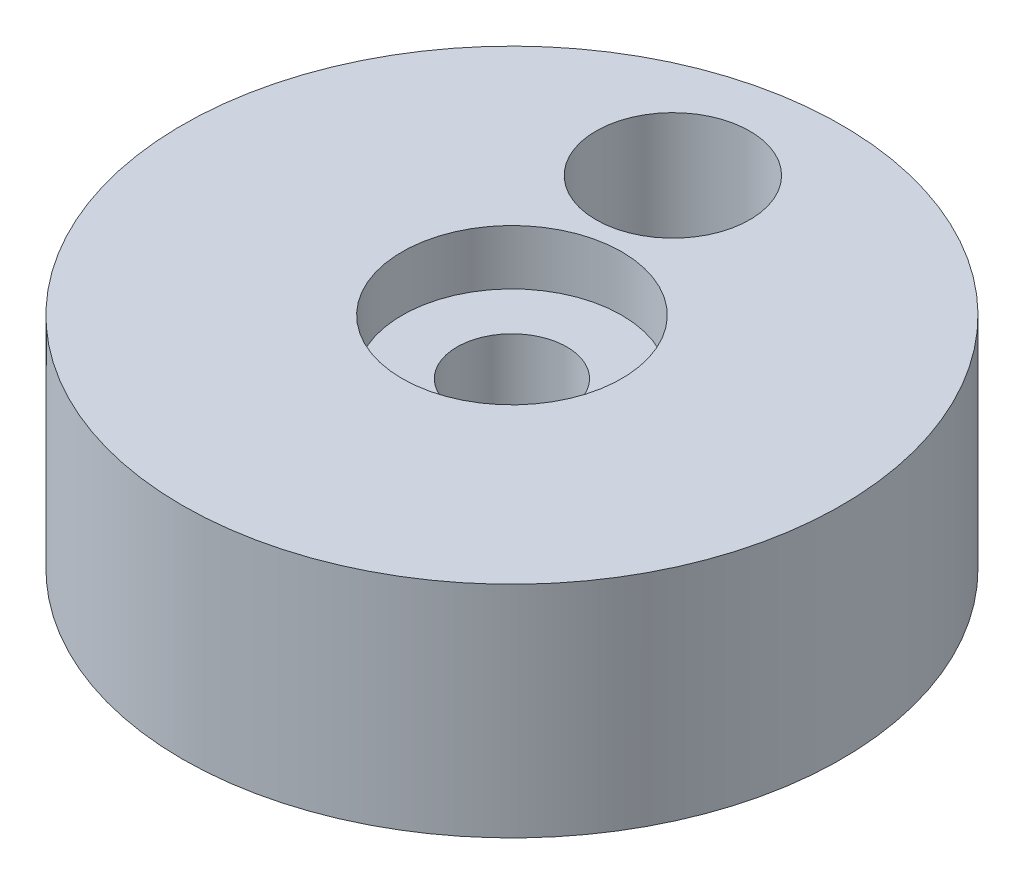
ISO-10303-21;
HEADER;
FILE_DESCRIPTION(('STEP AP214'),'2;1');
FILE_NAME('part.step','',(''),(''),'','','');
FILE_SCHEMA(('AUTOMOTIVE_DESIGN { 1 0 10303 214 1 1 1 1 }'));
ENDSEC;
DATA;
#1=APPLICATION_CONTEXT('core data for automotive mechanical design processes');
#2=APPLICATION_PROTOCOL_DEFINITION('international standard','automotive_design',2000,#1);
#3=PRODUCT_CONTEXT('',#1,'mechanical');
#4=PRODUCT('Part','Part','',(#3));
#5=PRODUCT_RELATED_PRODUCT_CATEGORY('part','',(#4));
#6=PRODUCT_DEFINITION_FORMATION('','',#4);
#7=PRODUCT_DEFINITION_CONTEXT('part definition',#1,'design');
#8=PRODUCT_DEFINITION('design','',#6,#7);
#9=PRODUCT_DEFINITION_SHAPE('','',#8);
#10=(LENGTH_UNIT() NAMED_UNIT(*) SI_UNIT(.MILLI.,.METRE.));
#11=(NAMED_UNIT(*) PLANE_ANGLE_UNIT() SI_UNIT($,.RADIAN.));
#12=(NAMED_UNIT(*) SI_UNIT($,.STERADIAN.) SOLID_ANGLE_UNIT());
#13=UNCERTAINTY_MEASURE_WITH_UNIT(LENGTH_MEASURE(1.E-05),#10,'distance_accuracy_value','');
#14=(GEOMETRIC_REPRESENTATION_CONTEXT(3) GLOBAL_UNCERTAINTY_ASSIGNED_CONTEXT((#13)) GLOBAL_UNIT_ASSIGNED_CONTEXT((#10,
#11,#12)) REPRESENTATION_CONTEXT('',''));
#15=CARTESIAN_POINT('',(0.,0.,0.));
#16=DIRECTION('',(0.,0.,1.));
#17=DIRECTION('',(1.,0.,0.));
#18=AXIS2_PLACEMENT_3D('',#15,#16,#17);
#19=CARTESIAN_POINT('',(0.,-12.7,0.));
#20=DIRECTION('',(0.,1.,0.));
#21=DIRECTION('',(0.,0.,1.));
#22=AXIS2_PLACEMENT_3D('',#19,#20,#21);
#23=CYLINDRICAL_SURFACE('',#22,19.05);
#24=CARTESIAN_POINT('',(0.,0.,0.));
#25=DIRECTION('',(0.,1.,0.));
#26=DIRECTION('',(0.,0.,1.));
#27=AXIS2_PLACEMENT_3D('',#24,#25,#26);
#28=CIRCLE('',#27,19.05);
#29=CARTESIAN_POINT('',(0.,0.,19.05));
#30=VERTEX_POINT('',#29);
#31=EDGE_CURVE('E86',#30,#30,#28,.T.);
#32=ORIENTED_EDGE('',*,*,#31,.F.);
#33=EDGE_LOOP('',(#32));
#34=FACE_BOUND('',#33,.T.);
#35=CARTESIAN_POINT('',(0.,-6.35,0.));
#36=DIRECTION('',(0.,1.,0.));
#37=DIRECTION('',(0.,0.,1.));
#38=AXIS2_PLACEMENT_3D('',#35,#36,#37);
#39=CIRCLE('',#38,19.05);
#40=CARTESIAN_POINT('',(-15.160050494038,-6.35,-11.5358297932233));
#41=VERTEX_POINT('',#40);
#42=CARTESIAN_POINT('',(-6.79711499679188,-6.35,-17.7961155233491));
#43=VERTEX_POINT('',#42);
#44=EDGE_CURVE('E11',#41,#43,#39,.F.);
#45=ORIENTED_EDGE('',*,*,#44,.F.);
#46=DIRECTION('',(0.,-1.,0.));
#47=VECTOR('',#46,1.);
#48=CARTESIAN_POINT('',(-15.160050494038,-9.525,-11.5358297932233));
#49=LINE('',#48,#47);
#50=CARTESIAN_POINT('',(-15.160050494038,-12.7,-11.5358297932233));
#51=VERTEX_POINT('',#50);
#52=EDGE_CURVE('E62',#41,#51,#49,.T.);
#53=ORIENTED_EDGE('',*,*,#52,.T.);
#54=CARTESIAN_POINT('',(0.,-12.7,0.));
#55=DIRECTION('',(0.,1.,0.));
#56=DIRECTION('',(0.,0.,1.));
#57=AXIS2_PLACEMENT_3D('',#54,#55,#56);
#58=CIRCLE('',#57,19.05);
#59=CARTESIAN_POINT('',(-6.79711499679187,-12.7,-17.7961155233491));
#60=VERTEX_POINT('',#59);
#61=EDGE_CURVE('E66',#51,#60,#58,.T.);
#62=ORIENTED_EDGE('',*,*,#61,.T.);
#63=DIRECTION('',(0.,-1.,0.));
#64=VECTOR('',#63,1.);
#65=CARTESIAN_POINT('',(-6.79711499679188,-9.525,-17.7961155233491));
#66=LINE('',#65,#64);
#67=EDGE_CURVE('E47',#60,#43,#66,.F.);
#68=ORIENTED_EDGE('',*,*,#67,.T.);
#69=EDGE_LOOP('',(#45,#53,#62,#68));
#70=FACE_BOUND('',#69,.T.);
#71=ADVANCED_FACE('F33',(#34,#70),#23,.T.);
#72=CARTESIAN_POINT('',(0.,-12.7,0.));
#73=DIRECTION('',(0.,1.,0.));
#74=DIRECTION('',(0.,0.,1.));
#75=AXIS2_PLACEMENT_3D('',#72,#73,#74);
#76=PLANE('',#75);
#77=CARTESIAN_POINT('',(0.,-12.7,0.));
#78=DIRECTION('',(0.,1.,0.));
#79=DIRECTION('',(0.,0.,1.));
#80=AXIS2_PLACEMENT_3D('',#77,#78,#79);
#81=CIRCLE('',#80,3.175);
#82=CARTESIAN_POINT('',(0.,-12.7,3.175));
#83=VERTEX_POINT('',#82);
#84=EDGE_CURVE('E83',#83,#83,#81,.T.);
#85=ORIENTED_EDGE('',*,*,#84,.T.);
#86=EDGE_LOOP('',(#85));
#87=FACE_BOUND('',#86,.T.);
#88=CARTESIAN_POINT('',(-2.34603064172123,-12.7,-11.6485670375102));
#89=DIRECTION('',(0.,1.,0.));
#90=DIRECTION('',(0.,0.,1.));
#91=AXIS2_PLACEMENT_3D('',#88,#89,#90);
#92=CIRCLE('',#91,4.445);
#93=CARTESIAN_POINT('',(-2.34603064172123,-12.7,-7.20356703751019));
#94=VERTEX_POINT('',#93);
#95=EDGE_CURVE('E73',#94,#94,#92,.T.);
#96=ORIENTED_EDGE('',*,*,#95,.T.);
#97=EDGE_LOOP('',(#96));
#98=FACE_BOUND('',#97,.T.);
#99=CARTESIAN_POINT('',(-13.4002812642719,-12.7,-17.9010499982098));
#100=DIRECTION('',(0.,1.,0.));
#101=DIRECTION('',(0.,0.,1.));
#102=AXIS2_PLACEMENT_3D('',#99,#100,#101);
#103=CIRCLE('',#102,6.604);
#104=EDGE_CURVE('E40',#60,#51,#103,.F.);
#105=ORIENTED_EDGE('',*,*,#104,.F.);
#106=ORIENTED_EDGE('',*,*,#61,.F.);
#107=EDGE_LOOP('',(#105,#106));
#108=FACE_BOUND('',#107,.T.);
#109=ADVANCED_FACE('F98',(#87,#98,#108),#76,.F.);
#110=CARTESIAN_POINT('',(0.,-17.78,0.));
#111=DIRECTION('',(0.,1.,0.));
#112=DIRECTION('',(0.,0.,1.));
#113=AXIS2_PLACEMENT_3D('',#110,#111,#112);
#114=CYLINDRICAL_SURFACE('',#113,3.175);
#115=CARTESIAN_POINT('',(0.,-3.175,0.));
#116=DIRECTION('',(0.,1.,0.));
#117=DIRECTION('',(0.,0.,1.));
#118=AXIS2_PLACEMENT_3D('',#115,#116,#117);
#119=CIRCLE('',#118,3.175);
#120=CARTESIAN_POINT('',(0.,-3.175,3.175));
#121=VERTEX_POINT('',#120);
#122=EDGE_CURVE('E80',#121,#121,#119,.F.);
#123=CARTESIAN_POINT('',(0.,-12.7,3.175));
#124=CARTESIAN_POINT('',(0.,-12.60078125,3.175));
#125=CARTESIAN_POINT('',(0.,-12.5015625,3.175));
#126=CARTESIAN_POINT('',(0.,-12.303125,3.175));
#127=CARTESIAN_POINT('',(0.,-12.20390625,3.175));
#128=CARTESIAN_POINT('',(0.,-12.00546875,3.175));
#129=CARTESIAN_POINT('',(0.,-11.90625,3.175));
#130=CARTESIAN_POINT('',(0.,-11.7078125,3.175));
#131=CARTESIAN_POINT('',(0.,-11.60859375,3.175));
#132=CARTESIAN_POINT('',(0.,-11.41015625,3.175));
#133=CARTESIAN_POINT('',(0.,-11.3109375,3.175));
#134=CARTESIAN_POINT('',(0.,-11.1125,3.175));
#135=CARTESIAN_POINT('',(0.,-11.01328125,3.175));
#136=CARTESIAN_POINT('',(0.,-10.81484375,3.175));
#137=CARTESIAN_POINT('',(0.,-10.715625,3.175));
#138=CARTESIAN_POINT('',(0.,-10.5171875,3.175));
#139=CARTESIAN_POINT('',(0.,-10.41796875,3.175));
#140=CARTESIAN_POINT('',(0.,-10.21953125,3.175));
#141=CARTESIAN_POINT('',(0.,-10.1203125,3.175));
#142=CARTESIAN_POINT('',(0.,-9.921875,3.175));
#143=CARTESIAN_POINT('',(0.,-9.82265625,3.175));
#144=CARTESIAN_POINT('',(0.,-9.62421875,3.175));
#145=CARTESIAN_POINT('',(0.,-9.525,3.175));
#146=CARTESIAN_POINT('',(0.,-9.3265625,3.175));
#147=CARTESIAN_POINT('',(0.,-9.22734375,3.175));
#148=CARTESIAN_POINT('',(0.,-9.02890625,3.175));
#149=CARTESIAN_POINT('',(0.,-8.9296875,3.175));
#150=CARTESIAN_POINT('',(0.,-8.73125,3.175));
#151=CARTESIAN_POINT('',(0.,-8.63203125,3.175));
#152=CARTESIAN_POINT('',(0.,-8.43359375,3.175));
#153=CARTESIAN_POINT('',(0.,-8.334375,3.175));
#154=CARTESIAN_POINT('',(0.,-8.1359375,3.175));
#155=CARTESIAN_POINT('',(0.,-8.03671875,3.175));
#156=CARTESIAN_POINT('',(0.,-7.83828125,3.175));
#157=CARTESIAN_POINT('',(0.,-7.7390625,3.175));
#158=CARTESIAN_POINT('',(0.,-7.540625,3.175));
#159=CARTESIAN_POINT('',(0.,-7.44140625,3.175));
#160=CARTESIAN_POINT('',(0.,-7.24296875,3.175));
#161=CARTESIAN_POINT('',(0.,-7.14375,3.175));
#162=CARTESIAN_POINT('',(0.,-6.9453125,3.175));
#163=CARTESIAN_POINT('',(0.,-6.84609375,3.175));
#164=CARTESIAN_POINT('',(0.,-6.64765625,3.175));
#165=CARTESIAN_POINT('',(0.,-6.5484375,3.175));
#166=CARTESIAN_POINT('',(0.,-6.35,3.175));
#167=CARTESIAN_POINT('',(0.,-6.25078125,3.175));
#168=CARTESIAN_POINT('',(0.,-6.05234375,3.175));
#169=CARTESIAN_POINT('',(0.,-5.953125,3.175));
#170=CARTESIAN_POINT('',(0.,-5.7546875,3.175));
#171=CARTESIAN_POINT('',(0.,-5.65546875,3.175));
#172=CARTESIAN_POINT('',(0.,-5.45703125,3.175));
#173=CARTESIAN_POINT('',(0.,-5.3578125,3.175));
#174=CARTESIAN_POINT('',(0.,-5.159375,3.175));
#175=CARTESIAN_POINT('',(0.,-5.06015625,3.175));
#176=CARTESIAN_POINT('',(0.,-4.86171875,3.175));
#177=CARTESIAN_POINT('',(0.,-4.7625,3.175));
#178=CARTESIAN_POINT('',(0.,-4.5640625,3.175));
#179=CARTESIAN_POINT('',(0.,-4.46484375,3.175));
#180=CARTESIAN_POINT('',(0.,-4.26640625,3.175));
#181=CARTESIAN_POINT('',(0.,-4.1671875,3.175));
#182=CARTESIAN_POINT('',(0.,-3.96875,3.175));
#183=CARTESIAN_POINT('',(0.,-3.86953125,3.175));
#184=CARTESIAN_POINT('',(0.,-3.67109375,3.175));
#185=CARTESIAN_POINT('',(0.,-3.571875,3.175));
#186=CARTESIAN_POINT('',(0.,-3.3734375,3.175));
#187=CARTESIAN_POINT('',(0.,-3.27421875,3.175));
#188=CARTESIAN_POINT('',(0.,-3.175,3.175));
#189=B_SPLINE_CURVE_WITH_KNOTS('',3,(#123,#124,#125,#126,#127,#128,#129,#130,#131,#132,#133,
#134,#135,#136,#137,#138,#139,#140,#141,#142,#143,#144,#145,#146,#147,#148,#149,#150,#151,#152,
#153,#154,#155,#156,#157,#158,#159,#160,#161,#162,#163,#164,#165,#166,#167,#168,#169,#170,#171,
#172,#173,#174,#175,#176,#177,#178,#179,#180,#181,#182,#183,#184,#185,#186,#187,#188),
.UNSPECIFIED.,.F.,.F.,(4,2,2,2,2,2,2,2,2,2,2,2,2,2,2,2,2,2,2,2,2,2,2,2,2,2,2,2,2,2,2,2,4),(0.,
0.29765625,0.5953125,0.892968749999999,1.190625,1.48828125,1.7859375,2.08359375,2.38125,
2.67890625,2.9765625,3.27421875,3.571875,3.86953125,4.1671875,4.46484375,4.7625,5.06015625,
5.3578125,5.65546875,5.953125,6.25078125,6.5484375,6.84609375,7.14375,7.44140625,7.7390625,
8.03671875,8.334375,8.63203125,8.9296875,9.22734375,9.525),.UNSPECIFIED.);
#190=EDGE_CURVE('BSEAM95',#83,#121,#189,.T.);
#191=ORIENTED_EDGE('',*,*,#84,.F.);
#192=ORIENTED_EDGE('',*,*,#122,.F.);
#193=ORIENTED_EDGE('',*,*,#190,.T.);
#194=ORIENTED_EDGE('',*,*,#190,.F.);
#195=EDGE_LOOP('',(#191,#193,#192,#194));
#196=FACE_BOUND('',#195,.T.);
#197=ADVANCED_FACE('F95',(#196),#114,.F.);
#198=CARTESIAN_POINT('',(0.,0.,0.));
#199=DIRECTION('',(0.,1.,0.));
#200=DIRECTION('',(0.,0.,1.));
#201=AXIS2_PLACEMENT_3D('',#198,#199,#200);
#202=PLANE('',#201);
#203=CARTESIAN_POINT('',(-2.34603064172123,0.,-11.6485670375102));
#204=DIRECTION('',(0.,1.,0.));
#205=DIRECTION('',(0.,0.,1.));
#206=AXIS2_PLACEMENT_3D('',#203,#204,#205);
#207=CIRCLE('',#206,4.445);
#208=CARTESIAN_POINT('',(-2.34603064172123,0.,-7.20356703751019));
#209=VERTEX_POINT('',#208);
#210=EDGE_CURVE('E68',#209,#209,#207,.T.);
#211=ORIENTED_EDGE('',*,*,#210,.F.);
#212=EDGE_LOOP('',(#211));
#213=FACE_BOUND('',#212,.T.);
#214=CARTESIAN_POINT('',(0.,0.,0.));
#215=DIRECTION('',(0.,1.,0.));
#216=DIRECTION('',(0.,0.,1.));
#217=AXIS2_PLACEMENT_3D('',#214,#215,#216);
#218=CIRCLE('',#217,6.35);
#219=CARTESIAN_POINT('',(0.,0.,6.35));
#220=VERTEX_POINT('',#219);
#221=EDGE_CURVE('E76',#220,#220,#218,.T.);
#222=ORIENTED_EDGE('',*,*,#221,.F.);
#223=EDGE_LOOP('',(#222));
#224=FACE_BOUND('',#223,.T.);
#225=ORIENTED_EDGE('',*,*,#31,.T.);
#226=EDGE_LOOP('',(#225));
#227=FACE_BOUND('',#226,.T.);
#228=ADVANCED_FACE('F97',(#213,#224,#227),#202,.T.);
#229=CARTESIAN_POINT('',(0.,-3.175,0.));
#230=DIRECTION('',(0.,1.,0.));
#231=DIRECTION('',(0.,0.,1.));
#232=AXIS2_PLACEMENT_3D('',#229,#230,#231);
#233=PLANE('',#232);
#234=CARTESIAN_POINT('',(0.,-3.175,0.));
#235=DIRECTION('',(0.,1.,0.));
#236=DIRECTION('',(0.,0.,1.));
#237=AXIS2_PLACEMENT_3D('',#234,#235,#236);
#238=CIRCLE('',#237,6.35);
#239=CARTESIAN_POINT('',(0.,-3.175,6.35));
#240=VERTEX_POINT('',#239);
#241=EDGE_CURVE('E77',#240,#240,#238,.T.);
#242=ORIENTED_EDGE('',*,*,#241,.T.);
#243=EDGE_LOOP('',(#242));
#244=FACE_BOUND('',#243,.T.);
#245=ORIENTED_EDGE('',*,*,#122,.T.);
#246=EDGE_LOOP('',(#245));
#247=FACE_BOUND('',#246,.T.);
#248=ADVANCED_FACE('F93',(#244,#247),#233,.T.);
#249=CARTESIAN_POINT('',(0.,-3.175,0.));
#250=DIRECTION('',(0.,1.,0.));
#251=DIRECTION('',(0.,0.,1.));
#252=AXIS2_PLACEMENT_3D('',#249,#250,#251);
#253=CYLINDRICAL_SURFACE('',#252,6.35);
#254=ORIENTED_EDGE('',*,*,#241,.F.);
#255=EDGE_LOOP('',(#254));
#256=FACE_BOUND('',#255,.T.);
#257=ORIENTED_EDGE('',*,*,#221,.T.);
#258=EDGE_LOOP('',(#257));
#259=FACE_BOUND('',#258,.T.);
#260=ADVANCED_FACE('F148',(#256,#259),#253,.F.);
#261=CARTESIAN_POINT('',(-2.34603064172123,-38.1,-11.6485670375102));
#262=DIRECTION('',(0.,1.,0.));
#263=DIRECTION('',(0.,0.,1.));
#264=AXIS2_PLACEMENT_3D('',#261,#262,#263);
#265=CYLINDRICAL_SURFACE('',#264,4.445);
#266=CARTESIAN_POINT('',(-2.34603064172123,0.,-7.20356703751019));
#267=CARTESIAN_POINT('',(-2.34603064172123,-0.132291666666666,-7.20356703751019));
#268=CARTESIAN_POINT('',(-2.34603064172123,-0.264583333333332,-7.20356703751019));
#269=CARTESIAN_POINT('',(-2.34603064172123,-0.529166666666666,-7.20356703751019));
#270=CARTESIAN_POINT('',(-2.34603064172123,-0.661458333333334,-7.20356703751019));
#271=CARTESIAN_POINT('',(-2.34603064172123,-0.926041666666669,-7.20356703751019));
#272=CARTESIAN_POINT('',(-2.34603064172123,-1.05833333333333,-7.20356703751019));
#273=CARTESIAN_POINT('',(-2.34603064172123,-1.32291666666667,-7.20356703751019));
#274=CARTESIAN_POINT('',(-2.34603064172123,-1.45520833333333,-7.20356703751019));
#275=CARTESIAN_POINT('',(-2.34603064172123,-1.71979166666667,-7.20356703751019));
#276=CARTESIAN_POINT('',(-2.34603064172123,-1.85208333333334,-7.20356703751019));
#277=CARTESIAN_POINT('',(-2.34603064172123,-2.11666666666667,-7.20356703751019));
#278=CARTESIAN_POINT('',(-2.34603064172123,-2.24895833333334,-7.20356703751019));
#279=CARTESIAN_POINT('',(-2.34603064172123,-2.51354166666667,-7.20356703751019));
#280=CARTESIAN_POINT('',(-2.34603064172123,-2.64583333333333,-7.20356703751019));
#281=CARTESIAN_POINT('',(-2.34603064172123,-2.91041666666667,-7.20356703751019));
#282=CARTESIAN_POINT('',(-2.34603064172123,-3.04270833333333,-7.20356703751019));
#283=CARTESIAN_POINT('',(-2.34603064172123,-3.30729166666667,-7.20356703751019));
#284=CARTESIAN_POINT('',(-2.34603064172123,-3.43958333333333,-7.20356703751019));
#285=CARTESIAN_POINT('',(-2.34603064172123,-3.70416666666667,-7.20356703751019));
#286=CARTESIAN_POINT('',(-2.34603064172123,-3.83645833333333,-7.20356703751019));
#287=CARTESIAN_POINT('',(-2.34603064172123,-4.10104166666667,-7.20356703751019));
#288=CARTESIAN_POINT('',(-2.34603064172123,-4.23333333333333,-7.20356703751019));
#289=CARTESIAN_POINT('',(-2.34603064172123,-4.49791666666667,-7.20356703751019));
#290=CARTESIAN_POINT('',(-2.34603064172123,-4.63020833333333,-7.20356703751019));
#291=CARTESIAN_POINT('',(-2.34603064172123,-4.89479166666667,-7.20356703751019));
#292=CARTESIAN_POINT('',(-2.34603064172123,-5.02708333333333,-7.20356703751019));
#293=CARTESIAN_POINT('',(-2.34603064172123,-5.29166666666667,-7.20356703751019));
#294=CARTESIAN_POINT('',(-2.34603064172123,-5.42395833333333,-7.20356703751019));
#295=CARTESIAN_POINT('',(-2.34603064172123,-5.68854166666667,-7.20356703751019));
#296=CARTESIAN_POINT('',(-2.34603064172123,-5.82083333333333,-7.20356703751019));
#297=CARTESIAN_POINT('',(-2.34603064172123,-6.08541666666667,-7.20356703751019));
#298=CARTESIAN_POINT('',(-2.34603064172123,-6.21770833333334,-7.20356703751019));
#299=CARTESIAN_POINT('',(-2.34603064172123,-6.48229166666667,-7.20356703751019));
#300=CARTESIAN_POINT('',(-2.34603064172123,-6.61458333333333,-7.20356703751019));
#301=CARTESIAN_POINT('',(-2.34603064172123,-6.87916666666667,-7.20356703751019));
#302=CARTESIAN_POINT('',(-2.34603064172123,-7.01145833333333,-7.20356703751019));
#303=CARTESIAN_POINT('',(-2.34603064172123,-7.27604166666666,-7.20356703751019));
#304=CARTESIAN_POINT('',(-2.34603064172123,-7.40833333333333,-7.20356703751019));
#305=CARTESIAN_POINT('',(-2.34603064172123,-7.67291666666666,-7.20356703751019));
#306=CARTESIAN_POINT('',(-2.34603064172123,-7.80520833333333,-7.20356703751019));
#307=CARTESIAN_POINT('',(-2.34603064172123,-8.06979166666666,-7.20356703751019));
#308=CARTESIAN_POINT('',(-2.34603064172123,-8.20208333333333,-7.20356703751019));
#309=CARTESIAN_POINT('',(-2.34603064172123,-8.46666666666667,-7.20356703751019));
#310=CARTESIAN_POINT('',(-2.34603064172123,-8.59895833333333,-7.20356703751019));
#311=CARTESIAN_POINT('',(-2.34603064172123,-8.86354166666666,-7.20356703751019));
#312=CARTESIAN_POINT('',(-2.34603064172123,-8.99583333333333,-7.20356703751019));
#313=CARTESIAN_POINT('',(-2.34603064172123,-9.26041666666666,-7.20356703751019));
#314=CARTESIAN_POINT('',(-2.34603064172123,-9.39270833333333,-7.20356703751019));
#315=CARTESIAN_POINT('',(-2.34603064172123,-9.65729166666667,-7.20356703751019));
#316=CARTESIAN_POINT('',(-2.34603064172123,-9.78958333333333,-7.20356703751019));
#317=CARTESIAN_POINT('',(-2.34603064172123,-10.0541666666667,-7.20356703751019));
#318=CARTESIAN_POINT('',(-2.34603064172123,-10.1864583333333,-7.20356703751019));
#319=CARTESIAN_POINT('',(-2.34603064172123,-10.4510416666667,-7.20356703751019));
#320=CARTESIAN_POINT('',(-2.34603064172123,-10.5833333333333,-7.20356703751019));
#321=CARTESIAN_POINT('',(-2.34603064172123,-10.8479166666667,-7.20356703751019));
#322=CARTESIAN_POINT('',(-2.34603064172123,-10.9802083333333,-7.20356703751019));
#323=CARTESIAN_POINT('',(-2.34603064172123,-11.2447916666667,-7.20356703751019));
#324=CARTESIAN_POINT('',(-2.34603064172123,-11.3770833333333,-7.20356703751019));
#325=CARTESIAN_POINT('',(-2.34603064172123,-11.6416666666667,-7.20356703751019));
#326=CARTESIAN_POINT('',(-2.34603064172123,-11.7739583333333,-7.20356703751019));
#327=CARTESIAN_POINT('',(-2.34603064172123,-12.0385416666667,-7.20356703751019));
#328=CARTESIAN_POINT('',(-2.34603064172123,-12.1708333333333,-7.20356703751019));
#329=CARTESIAN_POINT('',(-2.34603064172123,-12.4354166666667,-7.20356703751019));
#330=CARTESIAN_POINT('',(-2.34603064172123,-12.5677083333333,-7.20356703751019));
#331=CARTESIAN_POINT('',(-2.34603064172123,-12.7,-7.20356703751019));
#332=B_SPLINE_CURVE_WITH_KNOTS('',3,(#266,#267,#268,#269,#270,#271,#272,#273,#274,#275,#276,
#277,#278,#279,#280,#281,#282,#283,#284,#285,#286,#287,#288,#289,#290,#291,#292,#293,#294,#295,
#296,#297,#298,#299,#300,#301,#302,#303,#304,#305,#306,#307,#308,#309,#310,#311,#312,#313,#314,
#315,#316,#317,#318,#319,#320,#321,#322,#323,#324,#325,#326,#327,#328,#329,#330,#331),
.UNSPECIFIED.,.F.,.F.,(4,2,2,2,2,2,2,2,2,2,2,2,2,2,2,2,2,2,2,2,2,2,2,2,2,2,2,2,2,2,2,2,4),(0.,
0.396874999999998,0.793750000000003,1.190625,1.5875,1.984375,2.38125,2.778125,3.175,3.571875,
3.96875,4.365625,4.7625,5.159375,5.55625,5.953125,6.35,6.746875,7.14375,7.540625,7.9375,
8.334375,8.73125,9.128125,9.525,9.921875,10.31875,10.715625,11.1125,11.509375,11.90625,
12.303125,12.7),.UNSPECIFIED.);
#333=EDGE_CURVE('BSEAM123',#209,#94,#332,.T.);
#334=ORIENTED_EDGE('',*,*,#210,.T.);
#335=ORIENTED_EDGE('',*,*,#95,.F.);
#336=ORIENTED_EDGE('',*,*,#333,.T.);
#337=ORIENTED_EDGE('',*,*,#333,.F.);
#338=EDGE_LOOP('',(#334,#336,#335,#337));
#339=FACE_BOUND('',#338,.T.);
#340=ADVANCED_FACE('F123',(#339),#265,.F.);
#341=CARTESIAN_POINT('',(-13.4002812642719,-6.35,-17.9010499982098));
#342=DIRECTION('',(0.,-1.,0.));
#343=DIRECTION('',(0.,0.,-1.));
#344=AXIS2_PLACEMENT_3D('',#341,#342,#343);
#345=CYLINDRICAL_SURFACE('',#344,6.604);
#346=CARTESIAN_POINT('',(-13.4002812642719,-6.35,-17.9010499982098));
#347=DIRECTION('',(0.,1.,0.));
#348=DIRECTION('',(0.,0.,1.));
#349=AXIS2_PLACEMENT_3D('',#346,#347,#348);
#350=CIRCLE('',#349,6.604);
#351=EDGE_CURVE('E59',#41,#43,#350,.T.);
#352=ORIENTED_EDGE('',*,*,#351,.T.);
#353=ORIENTED_EDGE('',*,*,#67,.F.);
#354=ORIENTED_EDGE('',*,*,#104,.T.);
#355=ORIENTED_EDGE('',*,*,#52,.F.);
#356=EDGE_LOOP('',(#352,#353,#354,#355));
#357=FACE_BOUND('',#356,.T.);
#358=ADVANCED_FACE('F61',(#357),#345,.F.);
#359=CARTESIAN_POINT('',(-13.4002812642719,-6.35,-17.9010499982098));
#360=DIRECTION('',(0.,1.,0.));
#361=DIRECTION('',(0.,0.,1.));
#362=AXIS2_PLACEMENT_3D('',#359,#360,#361);
#363=PLANE('',#362);
#364=ORIENTED_EDGE('',*,*,#44,.T.);
#365=ORIENTED_EDGE('',*,*,#351,.F.);
#366=EDGE_LOOP('',(#364,#365));
#367=FACE_BOUND('',#366,.T.);
#368=ADVANCED_FACE('F58',(#367),#363,.F.);
#369=CLOSED_SHELL('',(#71,#109,#197,#228,#248,#260,#340,#358,#368));
#370=MANIFOLD_SOLID_BREP('B2',#369);
#371=ADVANCED_BREP_SHAPE_REPRESENTATION('',(#18,#370),#14);
#372=SHAPE_DEFINITION_REPRESENTATION(#9,#371);
ENDSEC;
END-ISO-10303-21;
